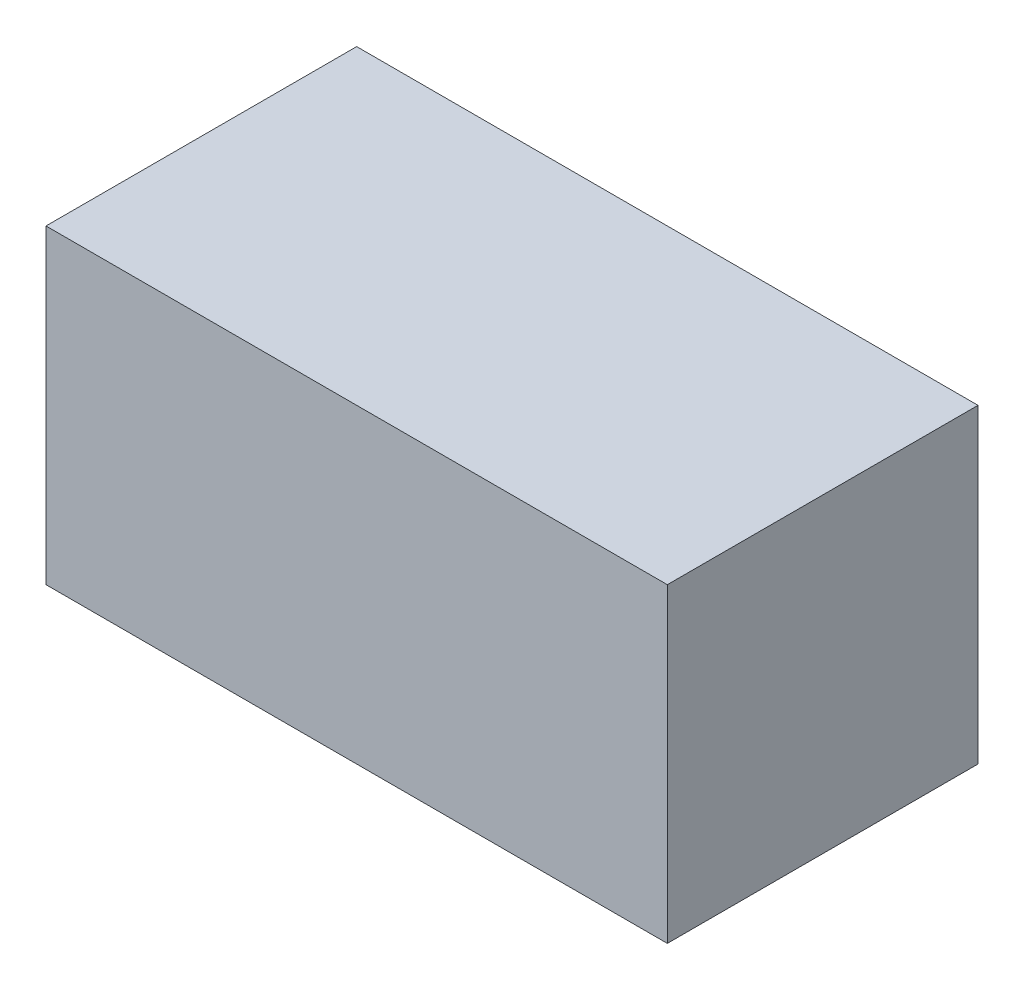
ISO-10303-21;
HEADER;
FILE_DESCRIPTION(('STEP AP214'),'2;1');
FILE_NAME('part.step','',(''),(''),'','','');
FILE_SCHEMA(('AUTOMOTIVE_DESIGN { 1 0 10303 214 1 1 1 1 }'));
ENDSEC;
DATA;
#1=APPLICATION_CONTEXT('core data for automotive mechanical design processes');
#2=APPLICATION_PROTOCOL_DEFINITION('international standard','automotive_design',2000,#1);
#3=PRODUCT_CONTEXT('',#1,'mechanical');
#4=PRODUCT('Part','Part','',(#3));
#5=PRODUCT_RELATED_PRODUCT_CATEGORY('part','',(#4));
#6=PRODUCT_DEFINITION_FORMATION('','',#4);
#7=PRODUCT_DEFINITION_CONTEXT('part definition',#1,'design');
#8=PRODUCT_DEFINITION('design','',#6,#7);
#9=PRODUCT_DEFINITION_SHAPE('','',#8);
#10=(LENGTH_UNIT() NAMED_UNIT(*) SI_UNIT(.MILLI.,.METRE.));
#11=(NAMED_UNIT(*) PLANE_ANGLE_UNIT() SI_UNIT($,.RADIAN.));
#12=(NAMED_UNIT(*) SI_UNIT($,.STERADIAN.) SOLID_ANGLE_UNIT());
#13=UNCERTAINTY_MEASURE_WITH_UNIT(LENGTH_MEASURE(1.E-05),#10,'distance_accuracy_value','');
#14=(GEOMETRIC_REPRESENTATION_CONTEXT(3) GLOBAL_UNCERTAINTY_ASSIGNED_CONTEXT((#13)) GLOBAL_UNIT_ASSIGNED_CONTEXT((#10,
#11,#12)) REPRESENTATION_CONTEXT('',''));
#15=CARTESIAN_POINT('',(0.,0.,0.));
#16=DIRECTION('',(0.,0.,1.));
#17=DIRECTION('',(1.,0.,0.));
#18=AXIS2_PLACEMENT_3D('',#15,#16,#17);
#19=CARTESIAN_POINT('',(0.,0.508,0.));
#20=DIRECTION('',(1.,0.,0.));
#21=DIRECTION('',(0.,0.,-1.));
#22=AXIS2_PLACEMENT_3D('',#19,#20,#21);
#23=PLANE('',#22);
#24=DIRECTION('',(0.,0.,1.));
#25=VECTOR('',#24,1.);
#26=CARTESIAN_POINT('',(0.,0.,0.));
#27=LINE('',#26,#25);
#28=CARTESIAN_POINT('',(0.,0.,-0.508));
#29=VERTEX_POINT('',#28);
#30=CARTESIAN_POINT('',(0.,0.,0.));
#31=VERTEX_POINT('',#30);
#32=EDGE_CURVE('E95',#29,#31,#27,.T.);
#33=ORIENTED_EDGE('',*,*,#32,.T.);
#34=DIRECTION('',(0.,-1.,0.));
#35=VECTOR('',#34,1.);
#36=CARTESIAN_POINT('',(0.,0.508,0.));
#37=LINE('',#36,#35);
#38=CARTESIAN_POINT('',(0.,0.508,0.));
#39=VERTEX_POINT('',#38);
#40=EDGE_CURVE('E11',#39,#31,#37,.T.);
#41=ORIENTED_EDGE('',*,*,#40,.F.);
#42=DIRECTION('',(0.,0.,1.));
#43=VECTOR('',#42,1.);
#44=CARTESIAN_POINT('',(0.,0.508,0.));
#45=LINE('',#44,#43);
#46=CARTESIAN_POINT('',(0.,0.508,-0.508));
#47=VERTEX_POINT('',#46);
#48=EDGE_CURVE('E83',#47,#39,#45,.T.);
#49=ORIENTED_EDGE('',*,*,#48,.F.);
#50=DIRECTION('',(0.,-1.,0.));
#51=VECTOR('',#50,1.);
#52=CARTESIAN_POINT('',(0.,0.508,-0.508));
#53=LINE('',#52,#51);
#54=EDGE_CURVE('E91',#47,#29,#53,.T.);
#55=ORIENTED_EDGE('',*,*,#54,.T.);
#56=EDGE_LOOP('',(#33,#41,#49,#55));
#57=FACE_BOUND('',#56,.T.);
#58=ADVANCED_FACE('F32',(#57),#23,.F.);
#59=CARTESIAN_POINT('',(0.,0.508,0.));
#60=DIRECTION('',(0.,0.,-1.));
#61=DIRECTION('',(-1.,0.,0.));
#62=AXIS2_PLACEMENT_3D('',#59,#60,#61);
#63=PLANE('',#62);
#64=DIRECTION('',(1.,0.,0.));
#65=VECTOR('',#64,1.);
#66=CARTESIAN_POINT('',(0.,0.,0.));
#67=LINE('',#66,#65);
#68=CARTESIAN_POINT('',(1.016,0.,0.));
#69=VERTEX_POINT('',#68);
#70=EDGE_CURVE('E87',#31,#69,#67,.T.);
#71=ORIENTED_EDGE('',*,*,#70,.T.);
#72=DIRECTION('',(0.,-1.,0.));
#73=VECTOR('',#72,1.);
#74=CARTESIAN_POINT('',(1.016,0.508,0.));
#75=LINE('',#74,#73);
#76=CARTESIAN_POINT('',(1.016,0.508,0.));
#77=VERTEX_POINT('',#76);
#78=EDGE_CURVE('E40',#77,#69,#75,.T.);
#79=ORIENTED_EDGE('',*,*,#78,.F.);
#80=DIRECTION('',(1.,0.,0.));
#81=VECTOR('',#80,1.);
#82=CARTESIAN_POINT('',(0.,0.508,0.));
#83=LINE('',#82,#81);
#84=EDGE_CURVE('E78',#39,#77,#83,.T.);
#85=ORIENTED_EDGE('',*,*,#84,.F.);
#86=ORIENTED_EDGE('',*,*,#40,.T.);
#87=EDGE_LOOP('',(#71,#79,#85,#86));
#88=FACE_BOUND('',#87,.T.);
#89=ADVANCED_FACE('F86',(#88),#63,.F.);
#90=CARTESIAN_POINT('',(1.016,0.508,0.));
#91=DIRECTION('',(-1.,0.,0.));
#92=DIRECTION('',(0.,0.,1.));
#93=AXIS2_PLACEMENT_3D('',#90,#91,#92);
#94=PLANE('',#93);
#95=DIRECTION('',(0.,0.,-1.));
#96=VECTOR('',#95,1.);
#97=CARTESIAN_POINT('',(1.016,0.,0.));
#98=LINE('',#97,#96);
#99=CARTESIAN_POINT('',(1.016,0.,-0.508));
#100=VERTEX_POINT('',#99);
#101=EDGE_CURVE('E65',#69,#100,#98,.T.);
#102=ORIENTED_EDGE('',*,*,#101,.T.);
#103=DIRECTION('',(0.,-1.,0.));
#104=VECTOR('',#103,1.);
#105=CARTESIAN_POINT('',(1.016,0.508,-0.508));
#106=LINE('',#105,#104);
#107=CARTESIAN_POINT('',(1.016,0.508,-0.508));
#108=VERTEX_POINT('',#107);
#109=EDGE_CURVE('E88',#108,#100,#106,.T.);
#110=ORIENTED_EDGE('',*,*,#109,.F.);
#111=DIRECTION('',(0.,0.,-1.));
#112=VECTOR('',#111,1.);
#113=CARTESIAN_POINT('',(1.016,0.508,0.));
#114=LINE('',#113,#112);
#115=EDGE_CURVE('E81',#77,#108,#114,.T.);
#116=ORIENTED_EDGE('',*,*,#115,.F.);
#117=ORIENTED_EDGE('',*,*,#78,.T.);
#118=EDGE_LOOP('',(#102,#110,#116,#117));
#119=FACE_BOUND('',#118,.T.);
#120=ADVANCED_FACE('F89',(#119),#94,.F.);
#121=CARTESIAN_POINT('',(0.,0.508,-0.508));
#122=DIRECTION('',(0.,0.,1.));
#123=DIRECTION('',(1.,0.,0.));
#124=AXIS2_PLACEMENT_3D('',#121,#122,#123);
#125=PLANE('',#124);
#126=DIRECTION('',(-1.,0.,0.));
#127=VECTOR('',#126,1.);
#128=CARTESIAN_POINT('',(0.,0.,-0.508));
#129=LINE('',#128,#127);
#130=EDGE_CURVE('E71',#100,#29,#129,.T.);
#131=ORIENTED_EDGE('',*,*,#130,.T.);
#132=ORIENTED_EDGE('',*,*,#54,.F.);
#133=DIRECTION('',(-1.,0.,0.));
#134=VECTOR('',#133,1.);
#135=CARTESIAN_POINT('',(0.,0.508,-0.508));
#136=LINE('',#135,#134);
#137=EDGE_CURVE('E48',#108,#47,#136,.T.);
#138=ORIENTED_EDGE('',*,*,#137,.F.);
#139=ORIENTED_EDGE('',*,*,#109,.T.);
#140=EDGE_LOOP('',(#131,#132,#138,#139));
#141=FACE_BOUND('',#140,.T.);
#142=ADVANCED_FACE('F102',(#141),#125,.F.);
#143=CARTESIAN_POINT('',(0.,0.508,0.));
#144=DIRECTION('',(0.,-1.,0.));
#145=DIRECTION('',(0.,0.,-1.));
#146=AXIS2_PLACEMENT_3D('',#143,#144,#145);
#147=PLANE('',#146);
#148=ORIENTED_EDGE('',*,*,#48,.T.);
#149=ORIENTED_EDGE('',*,*,#84,.T.);
#150=ORIENTED_EDGE('',*,*,#115,.T.);
#151=ORIENTED_EDGE('',*,*,#137,.T.);
#152=EDGE_LOOP('',(#148,#149,#150,#151));
#153=FACE_BOUND('',#152,.T.);
#154=ADVANCED_FACE('F79',(#153),#147,.F.);
#155=CARTESIAN_POINT('',(0.,0.,0.));
#156=DIRECTION('',(0.,-1.,0.));
#157=DIRECTION('',(0.,0.,-1.));
#158=AXIS2_PLACEMENT_3D('',#155,#156,#157);
#159=PLANE('',#158);
#160=ORIENTED_EDGE('',*,*,#32,.F.);
#161=ORIENTED_EDGE('',*,*,#130,.F.);
#162=ORIENTED_EDGE('',*,*,#101,.F.);
#163=ORIENTED_EDGE('',*,*,#70,.F.);
#164=EDGE_LOOP('',(#160,#161,#162,#163));
#165=FACE_BOUND('',#164,.T.);
#166=ADVANCED_FACE('F105',(#165),#159,.T.);
#167=CLOSED_SHELL('',(#58,#89,#120,#142,#154,#166));
#168=MANIFOLD_SOLID_BREP('B2',#167);
#169=ADVANCED_BREP_SHAPE_REPRESENTATION('',(#18,#168),#14);
#170=SHAPE_DEFINITION_REPRESENTATION(#9,#169);
ENDSEC;
END-ISO-10303-21;
